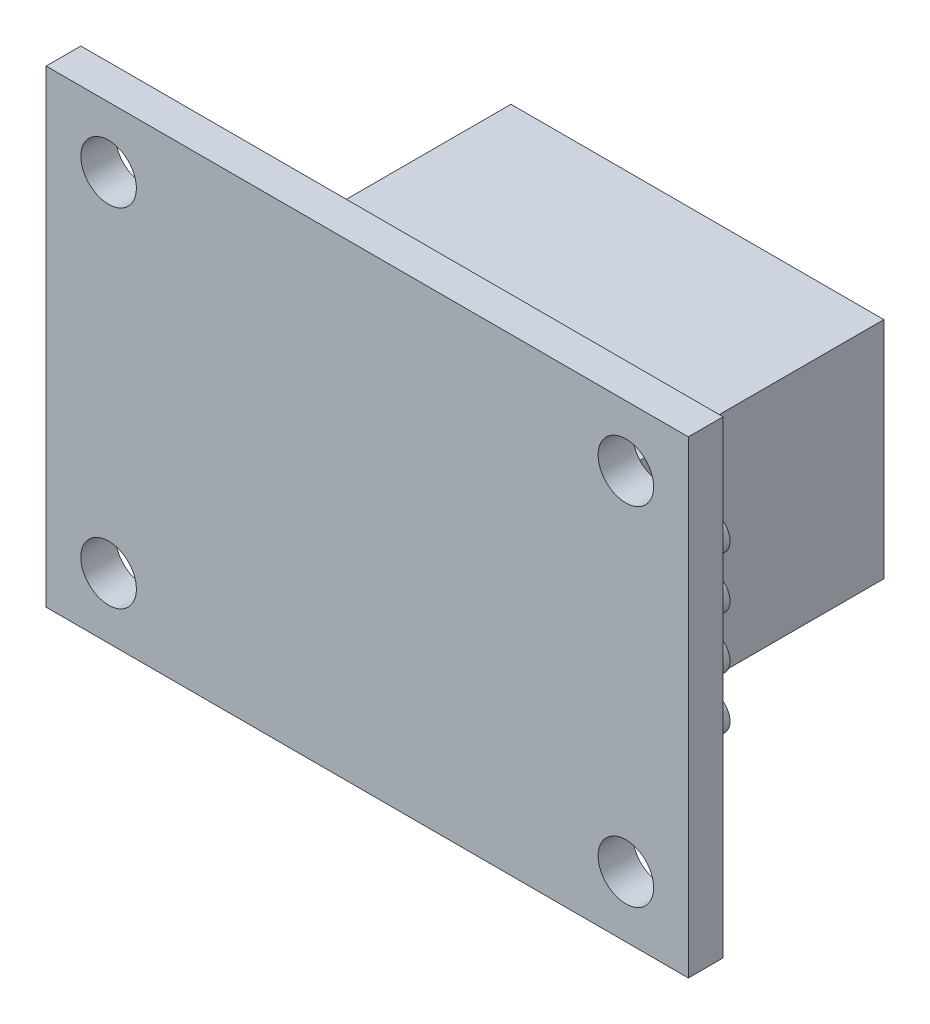
ISO-10303-21;
HEADER;
FILE_DESCRIPTION(('STEP AP214'),'2;1');
FILE_NAME('part.step','',(''),(''),'','','');
FILE_SCHEMA(('AUTOMOTIVE_DESIGN { 1 0 10303 214 1 1 1 1 }'));
ENDSEC;
DATA;
#1=APPLICATION_CONTEXT('core data for automotive mechanical design processes');
#2=APPLICATION_PROTOCOL_DEFINITION('international standard','automotive_design',2000,#1);
#3=PRODUCT_CONTEXT('',#1,'mechanical');
#4=PRODUCT('Part','Part','',(#3));
#5=PRODUCT_RELATED_PRODUCT_CATEGORY('part','',(#4));
#6=PRODUCT_DEFINITION_FORMATION('','',#4);
#7=PRODUCT_DEFINITION_CONTEXT('part definition',#1,'design');
#8=PRODUCT_DEFINITION('design','',#6,#7);
#9=PRODUCT_DEFINITION_SHAPE('','',#8);
#10=(LENGTH_UNIT() NAMED_UNIT(*) SI_UNIT(.MILLI.,.METRE.));
#11=(NAMED_UNIT(*) PLANE_ANGLE_UNIT() SI_UNIT($,.RADIAN.));
#12=(NAMED_UNIT(*) SI_UNIT($,.STERADIAN.) SOLID_ANGLE_UNIT());
#13=UNCERTAINTY_MEASURE_WITH_UNIT(LENGTH_MEASURE(1.E-05),#10,'distance_accuracy_value','');
#14=(GEOMETRIC_REPRESENTATION_CONTEXT(3) GLOBAL_UNCERTAINTY_ASSIGNED_CONTEXT((#13)) GLOBAL_UNIT_ASSIGNED_CONTEXT((#10,
#11,#12)) REPRESENTATION_CONTEXT('',''));
#15=CARTESIAN_POINT('',(0.,0.,0.));
#16=DIRECTION('',(0.,0.,1.));
#17=DIRECTION('',(1.,0.,0.));
#18=AXIS2_PLACEMENT_3D('',#15,#16,#17);
#19=CARTESIAN_POINT('',(0.,0.,0.));
#20=DIRECTION('',(0.,0.,1.));
#21=DIRECTION('',(1.,0.,0.));
#22=AXIS2_PLACEMENT_3D('',#19,#20,#21);
#23=PLANE('',#22);
#24=CARTESIAN_POINT('',(12.2736951983299,0.655532359081369,0.));
#25=DIRECTION('',(0.,0.,1.));
#26=DIRECTION('',(1.,0.,0.));
#27=AXIS2_PLACEMENT_3D('',#24,#25,#26);
#28=CIRCLE('',#27,1.);
#29=CARTESIAN_POINT('',(13.2736951983299,0.655532359081369,0.));
#30=VERTEX_POINT('',#29);
#31=EDGE_CURVE('E11',#30,#30,#28,.F.);
#32=ORIENTED_EDGE('',*,*,#31,.F.);
#33=EDGE_LOOP('',(#32));
#34=FACE_BOUND('',#33,.T.);
#35=CARTESIAN_POINT('',(12.2736951983299,-8.34446764091863,0.));
#36=DIRECTION('',(0.,0.,1.));
#37=DIRECTION('',(1.,0.,0.));
#38=AXIS2_PLACEMENT_3D('',#35,#36,#37);
#39=CIRCLE('',#38,1.);
#40=CARTESIAN_POINT('',(13.2736951983299,-8.34446764091863,0.));
#41=VERTEX_POINT('',#40);
#42=EDGE_CURVE('E45',#41,#41,#39,.F.);
#43=ORIENTED_EDGE('',*,*,#42,.F.);
#44=EDGE_LOOP('',(#43));
#45=FACE_BOUND('',#44,.T.);
#46=CARTESIAN_POINT('',(12.2736951983299,-5.34446764091863,0.));
#47=DIRECTION('',(0.,0.,1.));
#48=DIRECTION('',(1.,0.,0.));
#49=AXIS2_PLACEMENT_3D('',#46,#47,#48);
#50=CIRCLE('',#49,1.);
#51=CARTESIAN_POINT('',(13.2736951983299,-5.34446764091863,0.));
#52=VERTEX_POINT('',#51);
#53=EDGE_CURVE('E184',#52,#52,#50,.F.);
#54=ORIENTED_EDGE('',*,*,#53,.F.);
#55=EDGE_LOOP('',(#54));
#56=FACE_BOUND('',#55,.T.);
#57=CARTESIAN_POINT('',(12.2736951983299,-2.34446764091863,0.));
#58=DIRECTION('',(0.,0.,1.));
#59=DIRECTION('',(1.,0.,0.));
#60=AXIS2_PLACEMENT_3D('',#57,#58,#59);
#61=CIRCLE('',#60,1.);
#62=CARTESIAN_POINT('',(13.2736951983299,-2.34446764091863,0.));
#63=VERTEX_POINT('',#62);
#64=EDGE_CURVE('E181',#63,#63,#61,.F.);
#65=ORIENTED_EDGE('',*,*,#64,.F.);
#66=EDGE_LOOP('',(#65));
#67=FACE_BOUND('',#66,.T.);
#68=DIRECTION('',(0.,-1.,0.));
#69=VECTOR('',#68,1.);
#70=CARTESIAN_POINT('',(-21.1263048016701,9.65553235908142,0.));
#71=LINE('',#70,#69);
#72=CARTESIAN_POINT('',(-21.1263048016701,9.65553235908142,0.));
#73=VERTEX_POINT('',#72);
#74=CARTESIAN_POINT('',(-21.1263048016701,-17.3444676409186,0.));
#75=VERTEX_POINT('',#74);
#76=EDGE_CURVE('E149',#73,#75,#71,.T.);
#77=ORIENTED_EDGE('',*,*,#76,.F.);
#78=DIRECTION('',(-1.,0.,0.));
#79=VECTOR('',#78,1.);
#80=CARTESIAN_POINT('',(-21.1263048016701,9.65553235908142,0.));
#81=LINE('',#80,#79);
#82=CARTESIAN_POINT('',(15.8736951983299,9.65553235908142,0.));
#83=VERTEX_POINT('',#82);
#84=EDGE_CURVE('E156',#83,#73,#81,.T.);
#85=ORIENTED_EDGE('',*,*,#84,.F.);
#86=DIRECTION('',(0.,1.,0.));
#87=VECTOR('',#86,1.);
#88=CARTESIAN_POINT('',(15.8736951983299,9.65553235908142,0.));
#89=LINE('',#88,#87);
#90=CARTESIAN_POINT('',(15.8736951983299,-17.3444676409186,0.));
#91=VERTEX_POINT('',#90);
#92=EDGE_CURVE('E167',#91,#83,#89,.T.);
#93=ORIENTED_EDGE('',*,*,#92,.F.);
#94=DIRECTION('',(1.,0.,0.));
#95=VECTOR('',#94,1.);
#96=CARTESIAN_POINT('',(-21.1263048016701,-17.3444676409186,0.));
#97=LINE('',#96,#95);
#98=EDGE_CURVE('E165',#75,#91,#97,.T.);
#99=ORIENTED_EDGE('',*,*,#98,.F.);
#100=EDGE_LOOP('',(#77,#85,#93,#99));
#101=FACE_BOUND('',#100,.T.);
#102=CARTESIAN_POINT('',(12.2736951983299,6.15553235908137,0.));
#103=DIRECTION('',(0.,0.,-1.));
#104=DIRECTION('',(-1.,0.,0.));
#105=AXIS2_PLACEMENT_3D('',#102,#103,#104);
#106=CIRCLE('',#105,1.6);
#107=CARTESIAN_POINT('',(10.6736951983299,6.15553235908137,0.));
#108=VERTEX_POINT('',#107);
#109=EDGE_CURVE('E134',#108,#108,#106,.T.);
#110=ORIENTED_EDGE('',*,*,#109,.F.);
#111=EDGE_LOOP('',(#110));
#112=FACE_BOUND('',#111,.T.);
#113=CARTESIAN_POINT('',(12.2736951983299,-13.8444676409186,0.));
#114=DIRECTION('',(0.,0.,-1.));
#115=DIRECTION('',(-1.,0.,0.));
#116=AXIS2_PLACEMENT_3D('',#113,#114,#115);
#117=CIRCLE('',#116,1.6);
#118=CARTESIAN_POINT('',(10.6736951983299,-13.8444676409186,0.));
#119=VERTEX_POINT('',#118);
#120=EDGE_CURVE('E135',#119,#119,#117,.T.);
#121=ORIENTED_EDGE('',*,*,#120,.F.);
#122=EDGE_LOOP('',(#121));
#123=FACE_BOUND('',#122,.T.);
#124=CARTESIAN_POINT('',(-17.5263048016701,-13.8444676409186,0.));
#125=DIRECTION('',(0.,0.,-1.));
#126=DIRECTION('',(-1.,0.,0.));
#127=AXIS2_PLACEMENT_3D('',#124,#125,#126);
#128=CIRCLE('',#127,1.6);
#129=CARTESIAN_POINT('',(-19.1263048016701,-13.8444676409186,0.));
#130=VERTEX_POINT('',#129);
#131=EDGE_CURVE('E141',#130,#130,#128,.T.);
#132=ORIENTED_EDGE('',*,*,#131,.F.);
#133=EDGE_LOOP('',(#132));
#134=FACE_BOUND('',#133,.T.);
#135=CARTESIAN_POINT('',(-17.5263048016701,6.15553235908142,0.));
#136=DIRECTION('',(0.,0.,-1.));
#137=DIRECTION('',(-1.,0.,0.));
#138=AXIS2_PLACEMENT_3D('',#135,#136,#137);
#139=CIRCLE('',#138,1.6);
#140=CARTESIAN_POINT('',(-19.1263048016701,6.15553235908142,0.));
#141=VERTEX_POINT('',#140);
#142=EDGE_CURVE('E122',#141,#141,#139,.T.);
#143=ORIENTED_EDGE('',*,*,#142,.F.);
#144=EDGE_LOOP('',(#143));
#145=FACE_BOUND('',#144,.T.);
#146=DIRECTION('',(0.,-1.,0.));
#147=VECTOR('',#146,1.);
#148=CARTESIAN_POINT('',(8.13730517670774,2.137656104403,0.));
#149=LINE('',#148,#147);
#150=CARTESIAN_POINT('',(8.13730517670774,2.137656104403,0.));
#151=VERTEX_POINT('',#150);
#152=CARTESIAN_POINT('',(8.13730517670774,-10.7955269224542,0.));
#153=VERTEX_POINT('',#152);
#154=EDGE_CURVE('E52',#151,#153,#149,.T.);
#155=ORIENTED_EDGE('',*,*,#154,.F.);
#156=DIRECTION('',(1.,0.,0.));
#157=VECTOR('',#156,1.);
#158=CARTESIAN_POINT('',(8.13730517670774,2.137656104403,0.));
#159=LINE('',#158,#157);
#160=CARTESIAN_POINT('',(-13.3477871480387,2.137656104403,0.));
#161=VERTEX_POINT('',#160);
#162=EDGE_CURVE('E56',#161,#151,#159,.T.);
#163=ORIENTED_EDGE('',*,*,#162,.F.);
#164=DIRECTION('',(0.,1.,0.));
#165=VECTOR('',#164,1.);
#166=CARTESIAN_POINT('',(-13.3477871480387,2.137656104403,0.));
#167=LINE('',#166,#165);
#168=CARTESIAN_POINT('',(-13.3477871480387,-10.7955269224542,0.));
#169=VERTEX_POINT('',#168);
#170=EDGE_CURVE('E444',#169,#161,#167,.T.);
#171=ORIENTED_EDGE('',*,*,#170,.F.);
#172=DIRECTION('',(-1.,0.,0.));
#173=VECTOR('',#172,1.);
#174=CARTESIAN_POINT('',(8.13730517670774,-10.7955269224542,0.));
#175=LINE('',#174,#173);
#176=EDGE_CURVE('E446',#153,#169,#175,.T.);
#177=ORIENTED_EDGE('',*,*,#176,.F.);
#178=EDGE_LOOP('',(#155,#163,#171,#177));
#179=FACE_BOUND('',#178,.T.);
#180=ADVANCED_FACE('F37',(#34,#45,#56,#67,#101,#112,#123,#134,#145,#179),#23,.F.);
#181=CARTESIAN_POINT('',(-21.1263048016701,9.65553235908142,2.));
#182=DIRECTION('',(1.,0.,0.));
#183=DIRECTION('',(0.,1.,0.));
#184=AXIS2_PLACEMENT_3D('',#181,#182,#183);
#185=PLANE('',#184);
#186=ORIENTED_EDGE('',*,*,#76,.T.);
#187=DIRECTION('',(0.,0.,-1.));
#188=VECTOR('',#187,1.);
#189=CARTESIAN_POINT('',(-21.1263048016701,-17.3444676409186,2.));
#190=LINE('',#189,#188);
#191=CARTESIAN_POINT('',(-21.1263048016701,-17.3444676409186,2.));
#192=VERTEX_POINT('',#191);
#193=EDGE_CURVE('E178',#192,#75,#190,.T.);
#194=ORIENTED_EDGE('',*,*,#193,.F.);
#195=DIRECTION('',(0.,-1.,0.));
#196=VECTOR('',#195,1.);
#197=CARTESIAN_POINT('',(-21.1263048016701,9.65553235908142,2.));
#198=LINE('',#197,#196);
#199=CARTESIAN_POINT('',(-21.1263048016701,9.65553235908142,2.));
#200=VERTEX_POINT('',#199);
#201=EDGE_CURVE('E152',#200,#192,#198,.T.);
#202=ORIENTED_EDGE('',*,*,#201,.F.);
#203=DIRECTION('',(0.,0.,-1.));
#204=VECTOR('',#203,1.);
#205=CARTESIAN_POINT('',(-21.1263048016701,9.65553235908142,2.));
#206=LINE('',#205,#204);
#207=EDGE_CURVE('E162',#200,#73,#206,.T.);
#208=ORIENTED_EDGE('',*,*,#207,.T.);
#209=EDGE_LOOP('',(#186,#194,#202,#208));
#210=FACE_BOUND('',#209,.T.);
#211=ADVANCED_FACE('F39',(#210),#185,.F.);
#212=CARTESIAN_POINT('',(-21.1263048016701,-17.3444676409186,2.));
#213=DIRECTION('',(0.,1.,0.));
#214=DIRECTION('',(0.,0.,1.));
#215=AXIS2_PLACEMENT_3D('',#212,#213,#214);
#216=PLANE('',#215);
#217=ORIENTED_EDGE('',*,*,#98,.T.);
#218=DIRECTION('',(0.,0.,-1.));
#219=VECTOR('',#218,1.);
#220=CARTESIAN_POINT('',(15.8736951983299,-17.3444676409186,2.));
#221=LINE('',#220,#219);
#222=CARTESIAN_POINT('',(15.8736951983299,-17.3444676409186,2.));
#223=VERTEX_POINT('',#222);
#224=EDGE_CURVE('E175',#223,#91,#221,.T.);
#225=ORIENTED_EDGE('',*,*,#224,.F.);
#226=DIRECTION('',(1.,0.,0.));
#227=VECTOR('',#226,1.);
#228=CARTESIAN_POINT('',(-21.1263048016701,-17.3444676409186,2.));
#229=LINE('',#228,#227);
#230=EDGE_CURVE('E155',#192,#223,#229,.T.);
#231=ORIENTED_EDGE('',*,*,#230,.F.);
#232=ORIENTED_EDGE('',*,*,#193,.T.);
#233=EDGE_LOOP('',(#217,#225,#231,#232));
#234=FACE_BOUND('',#233,.T.);
#235=ADVANCED_FACE('F240',(#234),#216,.F.);
#236=CARTESIAN_POINT('',(15.8736951983299,9.65553235908142,2.));
#237=DIRECTION('',(-1.,0.,0.));
#238=DIRECTION('',(0.,-1.,0.));
#239=AXIS2_PLACEMENT_3D('',#236,#237,#238);
#240=PLANE('',#239);
#241=ORIENTED_EDGE('',*,*,#92,.T.);
#242=DIRECTION('',(0.,0.,-1.));
#243=VECTOR('',#242,1.);
#244=CARTESIAN_POINT('',(15.8736951983299,9.65553235908142,2.));
#245=LINE('',#244,#243);
#246=CARTESIAN_POINT('',(15.8736951983299,9.65553235908142,2.));
#247=VERTEX_POINT('',#246);
#248=EDGE_CURVE('E172',#247,#83,#245,.T.);
#249=ORIENTED_EDGE('',*,*,#248,.F.);
#250=DIRECTION('',(0.,1.,0.));
#251=VECTOR('',#250,1.);
#252=CARTESIAN_POINT('',(15.8736951983299,9.65553235908142,2.));
#253=LINE('',#252,#251);
#254=EDGE_CURVE('E158',#223,#247,#253,.T.);
#255=ORIENTED_EDGE('',*,*,#254,.F.);
#256=ORIENTED_EDGE('',*,*,#224,.T.);
#257=EDGE_LOOP('',(#241,#249,#255,#256));
#258=FACE_BOUND('',#257,.T.);
#259=ADVANCED_FACE('F237',(#258),#240,.F.);
#260=CARTESIAN_POINT('',(-21.1263048016701,9.65553235908142,2.));
#261=DIRECTION('',(0.,-1.,0.));
#262=DIRECTION('',(0.,0.,-1.));
#263=AXIS2_PLACEMENT_3D('',#260,#261,#262);
#264=PLANE('',#263);
#265=ORIENTED_EDGE('',*,*,#84,.T.);
#266=ORIENTED_EDGE('',*,*,#207,.F.);
#267=DIRECTION('',(-1.,0.,0.));
#268=VECTOR('',#267,1.);
#269=CARTESIAN_POINT('',(-21.1263048016701,9.65553235908142,2.));
#270=LINE('',#269,#268);
#271=EDGE_CURVE('E160',#247,#200,#270,.T.);
#272=ORIENTED_EDGE('',*,*,#271,.F.);
#273=ORIENTED_EDGE('',*,*,#248,.T.);
#274=EDGE_LOOP('',(#265,#266,#272,#273));
#275=FACE_BOUND('',#274,.T.);
#276=ADVANCED_FACE('F232',(#275),#264,.F.);
#277=CARTESIAN_POINT('',(0.,0.,2.));
#278=DIRECTION('',(0.,0.,1.));
#279=DIRECTION('',(1.,0.,0.));
#280=AXIS2_PLACEMENT_3D('',#277,#278,#279);
#281=PLANE('',#280);
#282=CARTESIAN_POINT('',(-17.5263048016701,6.15553235908142,2.));
#283=DIRECTION('',(0.,0.,-1.));
#284=DIRECTION('',(-1.,0.,0.));
#285=AXIS2_PLACEMENT_3D('',#282,#283,#284);
#286=CIRCLE('',#285,1.6);
#287=CARTESIAN_POINT('',(-19.1263048016701,6.15553235908142,2.));
#288=VERTEX_POINT('',#287);
#289=EDGE_CURVE('E125',#288,#288,#286,.T.);
#290=ORIENTED_EDGE('',*,*,#289,.T.);
#291=EDGE_LOOP('',(#290));
#292=FACE_BOUND('',#291,.T.);
#293=CARTESIAN_POINT('',(-17.5263048016701,-13.8444676409186,2.));
#294=DIRECTION('',(0.,0.,-1.));
#295=DIRECTION('',(-1.,0.,0.));
#296=AXIS2_PLACEMENT_3D('',#293,#294,#295);
#297=CIRCLE('',#296,1.6);
#298=CARTESIAN_POINT('',(-19.1263048016701,-13.8444676409186,2.));
#299=VERTEX_POINT('',#298);
#300=EDGE_CURVE('E138',#299,#299,#297,.T.);
#301=ORIENTED_EDGE('',*,*,#300,.T.);
#302=EDGE_LOOP('',(#301));
#303=FACE_BOUND('',#302,.T.);
#304=CARTESIAN_POINT('',(12.2736951983299,-13.8444676409186,2.));
#305=DIRECTION('',(0.,0.,-1.));
#306=DIRECTION('',(-1.,0.,0.));
#307=AXIS2_PLACEMENT_3D('',#304,#305,#306);
#308=CIRCLE('',#307,1.6);
#309=CARTESIAN_POINT('',(10.6736951983299,-13.8444676409186,2.));
#310=VERTEX_POINT('',#309);
#311=EDGE_CURVE('E131',#310,#310,#308,.T.);
#312=ORIENTED_EDGE('',*,*,#311,.T.);
#313=EDGE_LOOP('',(#312));
#314=FACE_BOUND('',#313,.T.);
#315=CARTESIAN_POINT('',(12.2736951983299,6.15553235908137,2.));
#316=DIRECTION('',(0.,0.,-1.));
#317=DIRECTION('',(-1.,0.,0.));
#318=AXIS2_PLACEMENT_3D('',#315,#316,#317);
#319=CIRCLE('',#318,1.6);
#320=CARTESIAN_POINT('',(10.6736951983299,6.15553235908137,2.));
#321=VERTEX_POINT('',#320);
#322=EDGE_CURVE('E146',#321,#321,#319,.T.);
#323=ORIENTED_EDGE('',*,*,#322,.T.);
#324=EDGE_LOOP('',(#323));
#325=FACE_BOUND('',#324,.T.);
#326=ORIENTED_EDGE('',*,*,#201,.T.);
#327=ORIENTED_EDGE('',*,*,#230,.T.);
#328=ORIENTED_EDGE('',*,*,#254,.T.);
#329=ORIENTED_EDGE('',*,*,#271,.T.);
#330=EDGE_LOOP('',(#326,#327,#328,#329));
#331=FACE_BOUND('',#330,.T.);
#332=ADVANCED_FACE('F229',(#292,#303,#314,#325,#331),#281,.T.);
#333=CARTESIAN_POINT('',(12.2736951983299,6.15553235908137,2.));
#334=DIRECTION('',(0.,0.,-1.));
#335=DIRECTION('',(-1.,0.,0.));
#336=AXIS2_PLACEMENT_3D('',#333,#334,#335);
#337=CYLINDRICAL_SURFACE('',#336,1.6);
#338=ORIENTED_EDGE('',*,*,#322,.F.);
#339=EDGE_LOOP('',(#338));
#340=FACE_BOUND('',#339,.T.);
#341=ORIENTED_EDGE('',*,*,#109,.T.);
#342=EDGE_LOOP('',(#341));
#343=FACE_BOUND('',#342,.T.);
#344=ADVANCED_FACE('F226',(#340,#343),#337,.F.);
#345=CARTESIAN_POINT('',(12.2736951983299,-13.8444676409186,2.));
#346=DIRECTION('',(0.,0.,-1.));
#347=DIRECTION('',(-1.,0.,0.));
#348=AXIS2_PLACEMENT_3D('',#345,#346,#347);
#349=CYLINDRICAL_SURFACE('',#348,1.6);
#350=ORIENTED_EDGE('',*,*,#311,.F.);
#351=EDGE_LOOP('',(#350));
#352=FACE_BOUND('',#351,.T.);
#353=ORIENTED_EDGE('',*,*,#120,.T.);
#354=EDGE_LOOP('',(#353));
#355=FACE_BOUND('',#354,.T.);
#356=ADVANCED_FACE('F220',(#352,#355),#349,.F.);
#357=CARTESIAN_POINT('',(-17.5263048016701,-13.8444676409186,2.));
#358=DIRECTION('',(0.,0.,-1.));
#359=DIRECTION('',(-1.,0.,0.));
#360=AXIS2_PLACEMENT_3D('',#357,#358,#359);
#361=CYLINDRICAL_SURFACE('',#360,1.6);
#362=ORIENTED_EDGE('',*,*,#300,.F.);
#363=EDGE_LOOP('',(#362));
#364=FACE_BOUND('',#363,.T.);
#365=ORIENTED_EDGE('',*,*,#131,.T.);
#366=EDGE_LOOP('',(#365));
#367=FACE_BOUND('',#366,.T.);
#368=ADVANCED_FACE('F212',(#364,#367),#361,.F.);
#369=CARTESIAN_POINT('',(-17.5263048016701,6.15553235908142,2.));
#370=DIRECTION('',(0.,0.,-1.));
#371=DIRECTION('',(-1.,0.,0.));
#372=AXIS2_PLACEMENT_3D('',#369,#370,#371);
#373=CYLINDRICAL_SURFACE('',#372,1.6);
#374=ORIENTED_EDGE('',*,*,#289,.F.);
#375=EDGE_LOOP('',(#374));
#376=FACE_BOUND('',#375,.T.);
#377=ORIENTED_EDGE('',*,*,#142,.T.);
#378=EDGE_LOOP('',(#377));
#379=FACE_BOUND('',#378,.T.);
#380=ADVANCED_FACE('F210',(#376,#379),#373,.F.);
#381=CARTESIAN_POINT('',(8.13730517670774,2.137656104403,-17.));
#382=DIRECTION('',(-1.,0.,0.));
#383=DIRECTION('',(0.,0.,1.));
#384=AXIS2_PLACEMENT_3D('',#381,#382,#383);
#385=PLANE('',#384);
#386=ORIENTED_EDGE('',*,*,#154,.T.);
#387=DIRECTION('',(0.,0.,1.));
#388=VECTOR('',#387,1.);
#389=CARTESIAN_POINT('',(8.13730517670774,-10.7955269224542,-17.));
#390=LINE('',#389,#388);
#391=CARTESIAN_POINT('',(8.13730517670774,-10.7955269224542,-17.));
#392=VERTEX_POINT('',#391);
#393=EDGE_CURVE('E105',#392,#153,#390,.T.);
#394=ORIENTED_EDGE('',*,*,#393,.F.);
#395=DIRECTION('',(0.,-1.,0.));
#396=VECTOR('',#395,1.);
#397=CARTESIAN_POINT('',(8.13730517670774,2.137656104403,-17.));
#398=LINE('',#397,#396);
#399=CARTESIAN_POINT('',(8.13730517670774,2.137656104403,-17.));
#400=VERTEX_POINT('',#399);
#401=EDGE_CURVE('E111',#400,#392,#398,.T.);
#402=ORIENTED_EDGE('',*,*,#401,.F.);
#403=DIRECTION('',(0.,0.,1.));
#404=VECTOR('',#403,1.);
#405=CARTESIAN_POINT('',(8.13730517670774,2.137656104403,-17.));
#406=LINE('',#405,#404);
#407=EDGE_CURVE('E448',#400,#151,#406,.T.);
#408=ORIENTED_EDGE('',*,*,#407,.T.);
#409=EDGE_LOOP('',(#386,#394,#402,#408));
#410=FACE_BOUND('',#409,.T.);
#411=ADVANCED_FACE('F121',(#410),#385,.F.);
#412=CARTESIAN_POINT('',(8.13730517670774,-10.7955269224542,-17.));
#413=DIRECTION('',(0.,1.,0.));
#414=DIRECTION('',(0.,0.,1.));
#415=AXIS2_PLACEMENT_3D('',#412,#413,#414);
#416=PLANE('',#415);
#417=ORIENTED_EDGE('',*,*,#176,.T.);
#418=DIRECTION('',(0.,0.,1.));
#419=VECTOR('',#418,1.);
#420=CARTESIAN_POINT('',(-13.3477871480387,-10.7955269224542,-17.));
#421=LINE('',#420,#419);
#422=CARTESIAN_POINT('',(-13.3477871480387,-10.7955269224542,-17.));
#423=VERTEX_POINT('',#422);
#424=EDGE_CURVE('E107',#423,#169,#421,.T.);
#425=ORIENTED_EDGE('',*,*,#424,.F.);
#426=DIRECTION('',(-1.,0.,0.));
#427=VECTOR('',#426,1.);
#428=CARTESIAN_POINT('',(8.13730517670774,-10.7955269224542,-17.));
#429=LINE('',#428,#427);
#430=EDGE_CURVE('E100',#392,#423,#429,.T.);
#431=ORIENTED_EDGE('',*,*,#430,.F.);
#432=ORIENTED_EDGE('',*,*,#393,.T.);
#433=EDGE_LOOP('',(#417,#425,#431,#432));
#434=FACE_BOUND('',#433,.T.);
#435=ADVANCED_FACE('F103',(#434),#416,.F.);
#436=CARTESIAN_POINT('',(-13.3477871480387,2.137656104403,-17.));
#437=DIRECTION('',(1.,0.,0.));
#438=DIRECTION('',(0.,0.,-1.));
#439=AXIS2_PLACEMENT_3D('',#436,#437,#438);
#440=PLANE('',#439);
#441=ORIENTED_EDGE('',*,*,#170,.T.);
#442=DIRECTION('',(0.,0.,1.));
#443=VECTOR('',#442,1.);
#444=CARTESIAN_POINT('',(-13.3477871480387,2.137656104403,-17.));
#445=LINE('',#444,#443);
#446=CARTESIAN_POINT('',(-13.3477871480387,2.137656104403,-17.));
#447=VERTEX_POINT('',#446);
#448=EDGE_CURVE('E127',#447,#161,#445,.T.);
#449=ORIENTED_EDGE('',*,*,#448,.F.);
#450=DIRECTION('',(0.,1.,0.));
#451=VECTOR('',#450,1.);
#452=CARTESIAN_POINT('',(-13.3477871480387,2.137656104403,-17.));
#453=LINE('',#452,#451);
#454=EDGE_CURVE('E110',#423,#447,#453,.T.);
#455=ORIENTED_EDGE('',*,*,#454,.F.);
#456=ORIENTED_EDGE('',*,*,#424,.T.);
#457=EDGE_LOOP('',(#441,#449,#455,#456));
#458=FACE_BOUND('',#457,.T.);
#459=ADVANCED_FACE('F359',(#458),#440,.F.);
#460=CARTESIAN_POINT('',(8.13730517670774,2.137656104403,-17.));
#461=DIRECTION('',(0.,-1.,0.));
#462=DIRECTION('',(0.,0.,-1.));
#463=AXIS2_PLACEMENT_3D('',#460,#461,#462);
#464=PLANE('',#463);
#465=ORIENTED_EDGE('',*,*,#162,.T.);
#466=ORIENTED_EDGE('',*,*,#407,.F.);
#467=DIRECTION('',(1.,0.,0.));
#468=VECTOR('',#467,1.);
#469=CARTESIAN_POINT('',(8.13730517670774,2.137656104403,-17.));
#470=LINE('',#469,#468);
#471=EDGE_CURVE('E116',#447,#400,#470,.T.);
#472=ORIENTED_EDGE('',*,*,#471,.F.);
#473=ORIENTED_EDGE('',*,*,#448,.T.);
#474=EDGE_LOOP('',(#465,#466,#472,#473));
#475=FACE_BOUND('',#474,.T.);
#476=ADVANCED_FACE('F356',(#475),#464,.F.);
#477=CARTESIAN_POINT('',(0.,0.,-17.));
#478=DIRECTION('',(0.,0.,-1.));
#479=DIRECTION('',(-1.,0.,0.));
#480=AXIS2_PLACEMENT_3D('',#477,#478,#479);
#481=PLANE('',#480);
#482=ORIENTED_EDGE('',*,*,#401,.T.);
#483=ORIENTED_EDGE('',*,*,#430,.T.);
#484=ORIENTED_EDGE('',*,*,#454,.T.);
#485=ORIENTED_EDGE('',*,*,#471,.T.);
#486=EDGE_LOOP('',(#482,#483,#484,#485));
#487=FACE_BOUND('',#486,.T.);
#488=ADVANCED_FACE('F114',(#487),#481,.T.);
#489=CARTESIAN_POINT('',(12.2736951983299,-2.34446764091863,-3.));
#490=DIRECTION('',(0.,0.,1.));
#491=DIRECTION('',(1.,0.,0.));
#492=AXIS2_PLACEMENT_3D('',#489,#490,#491);
#493=CYLINDRICAL_SURFACE('',#492,1.);
#494=CARTESIAN_POINT('',(12.2736951983299,-2.34446764091863,-3.));
#495=DIRECTION('',(0.,0.,-1.));
#496=DIRECTION('',(-1.,0.,0.));
#497=AXIS2_PLACEMENT_3D('',#494,#495,#496);
#498=CIRCLE('',#497,1.);
#499=CARTESIAN_POINT('',(11.2736951983299,-2.34446764091863,-3.));
#500=VERTEX_POINT('',#499);
#501=EDGE_CURVE('E454',#500,#500,#498,.T.);
#502=ORIENTED_EDGE('',*,*,#501,.F.);
#503=EDGE_LOOP('',(#502));
#504=FACE_BOUND('',#503,.T.);
#505=ORIENTED_EDGE('',*,*,#64,.T.);
#506=EDGE_LOOP('',(#505));
#507=FACE_BOUND('',#506,.T.);
#508=ADVANCED_FACE('F275',(#504,#507),#493,.T.);
#509=CARTESIAN_POINT('',(12.2736951983299,-2.34446764091863,-3.));
#510=DIRECTION('',(0.,0.,-1.));
#511=DIRECTION('',(-1.,0.,0.));
#512=AXIS2_PLACEMENT_3D('',#509,#510,#511);
#513=PLANE('',#512);
#514=ORIENTED_EDGE('',*,*,#501,.T.);
#515=EDGE_LOOP('',(#514));
#516=FACE_BOUND('',#515,.T.);
#517=ADVANCED_FACE('F280',(#516),#513,.T.);
#518=CARTESIAN_POINT('',(12.2736951983299,-5.34446764091863,-3.));
#519=DIRECTION('',(0.,0.,1.));
#520=DIRECTION('',(1.,0.,0.));
#521=AXIS2_PLACEMENT_3D('',#518,#519,#520);
#522=CYLINDRICAL_SURFACE('',#521,1.);
#523=CARTESIAN_POINT('',(12.2736951983299,-5.34446764091863,-3.));
#524=DIRECTION('',(0.,0.,-1.));
#525=DIRECTION('',(-1.,0.,0.));
#526=AXIS2_PLACEMENT_3D('',#523,#524,#525);
#527=CIRCLE('',#526,1.);
#528=CARTESIAN_POINT('',(11.2736951983299,-5.34446764091863,-3.));
#529=VERTEX_POINT('',#528);
#530=EDGE_CURVE('E459',#529,#529,#527,.T.);
#531=ORIENTED_EDGE('',*,*,#530,.F.);
#532=EDGE_LOOP('',(#531));
#533=FACE_BOUND('',#532,.T.);
#534=ORIENTED_EDGE('',*,*,#53,.T.);
#535=EDGE_LOOP('',(#534));
#536=FACE_BOUND('',#535,.T.);
#537=ADVANCED_FACE('F290',(#533,#536),#522,.T.);
#538=CARTESIAN_POINT('',(12.2736951983299,-5.34446764091863,-3.));
#539=DIRECTION('',(0.,0.,-1.));
#540=DIRECTION('',(-1.,0.,0.));
#541=AXIS2_PLACEMENT_3D('',#538,#539,#540);
#542=PLANE('',#541);
#543=ORIENTED_EDGE('',*,*,#530,.T.);
#544=EDGE_LOOP('',(#543));
#545=FACE_BOUND('',#544,.T.);
#546=ADVANCED_FACE('F300',(#545),#542,.T.);
#547=CARTESIAN_POINT('',(12.2736951983299,-8.34446764091863,-3.));
#548=DIRECTION('',(0.,0.,1.));
#549=DIRECTION('',(1.,0.,0.));
#550=AXIS2_PLACEMENT_3D('',#547,#548,#549);
#551=CYLINDRICAL_SURFACE('',#550,1.);
#552=CARTESIAN_POINT('',(12.2736951983299,-8.34446764091863,-3.));
#553=DIRECTION('',(0.,0.,-1.));
#554=DIRECTION('',(-1.,0.,0.));
#555=AXIS2_PLACEMENT_3D('',#552,#553,#554);
#556=CIRCLE('',#555,1.);
#557=CARTESIAN_POINT('',(11.2736951983299,-8.34446764091863,-3.));
#558=VERTEX_POINT('',#557);
#559=EDGE_CURVE('E462',#558,#558,#556,.T.);
#560=ORIENTED_EDGE('',*,*,#559,.F.);
#561=EDGE_LOOP('',(#560));
#562=FACE_BOUND('',#561,.T.);
#563=ORIENTED_EDGE('',*,*,#42,.T.);
#564=EDGE_LOOP('',(#563));
#565=FACE_BOUND('',#564,.T.);
#566=ADVANCED_FACE('F189',(#562,#565),#551,.T.);
#567=CARTESIAN_POINT('',(12.2736951983299,-8.34446764091863,-3.));
#568=DIRECTION('',(0.,0.,-1.));
#569=DIRECTION('',(-1.,0.,0.));
#570=AXIS2_PLACEMENT_3D('',#567,#568,#569);
#571=PLANE('',#570);
#572=ORIENTED_EDGE('',*,*,#559,.T.);
#573=EDGE_LOOP('',(#572));
#574=FACE_BOUND('',#573,.T.);
#575=ADVANCED_FACE('F319',(#574),#571,.T.);
#576=CARTESIAN_POINT('',(12.2736951983299,0.655532359081369,-3.));
#577=DIRECTION('',(0.,0.,1.));
#578=DIRECTION('',(1.,0.,0.));
#579=AXIS2_PLACEMENT_3D('',#576,#577,#578);
#580=CYLINDRICAL_SURFACE('',#579,1.);
#581=CARTESIAN_POINT('',(12.2736951983299,0.655532359081369,-3.));
#582=DIRECTION('',(0.,0.,-1.));
#583=DIRECTION('',(-1.,0.,0.));
#584=AXIS2_PLACEMENT_3D('',#581,#582,#583);
#585=CIRCLE('',#584,1.);
#586=CARTESIAN_POINT('',(11.2736951983299,0.655532359081369,-3.));
#587=VERTEX_POINT('',#586);
#588=EDGE_CURVE('E465',#587,#587,#585,.T.);
#589=ORIENTED_EDGE('',*,*,#588,.F.);
#590=EDGE_LOOP('',(#589));
#591=FACE_BOUND('',#590,.T.);
#592=ORIENTED_EDGE('',*,*,#31,.T.);
#593=EDGE_LOOP('',(#592));
#594=FACE_BOUND('',#593,.T.);
#595=ADVANCED_FACE('F329',(#591,#594),#580,.T.);
#596=CARTESIAN_POINT('',(12.2736951983299,0.655532359081369,-3.));
#597=DIRECTION('',(0.,0.,-1.));
#598=DIRECTION('',(-1.,0.,0.));
#599=AXIS2_PLACEMENT_3D('',#596,#597,#598);
#600=PLANE('',#599);
#601=ORIENTED_EDGE('',*,*,#588,.T.);
#602=EDGE_LOOP('',(#601));
#603=FACE_BOUND('',#602,.T.);
#604=ADVANCED_FACE('F339',(#603),#600,.T.);
#605=CLOSED_SHELL('',(#180,#211,#235,#259,#276,#332,#344,#356,#368,#380,#411,#435,#459,#476,
#488,#508,#517,#537,#546,#566,#575,#595,#604));
#606=MANIFOLD_SOLID_BREP('B2',#605);
#607=ADVANCED_BREP_SHAPE_REPRESENTATION('',(#18,#606),#14);
#608=SHAPE_DEFINITION_REPRESENTATION(#9,#607);
ENDSEC;
END-ISO-10303-21;
